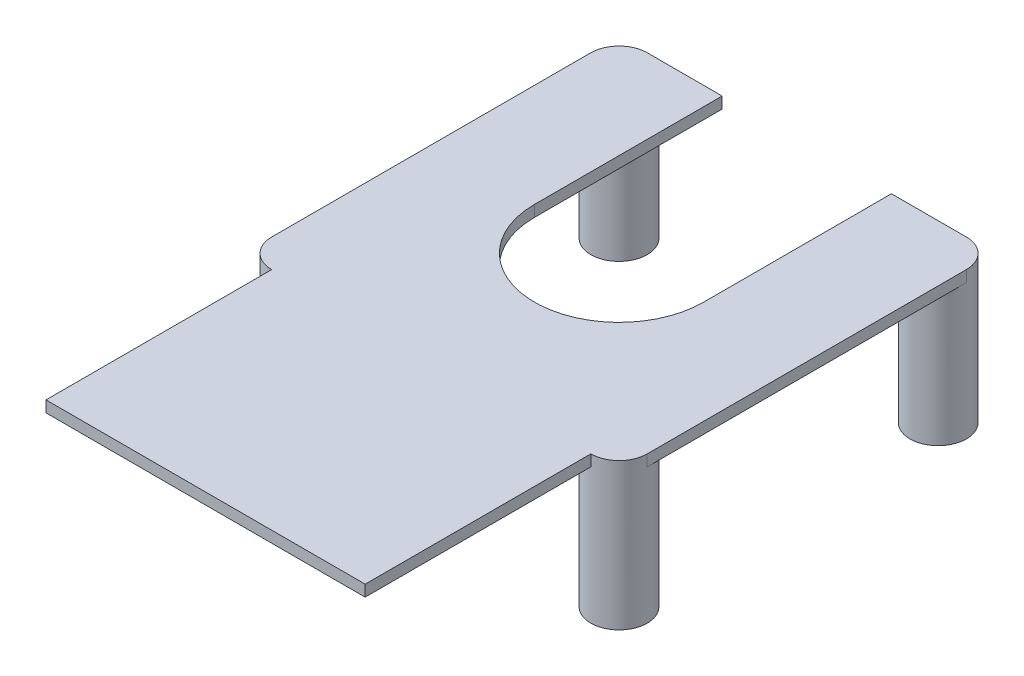
ISO-10303-21;
HEADER;
FILE_DESCRIPTION(('STEP AP214'),'2;1');
FILE_NAME('part.step','',(''),(''),'','','');
FILE_SCHEMA(('AUTOMOTIVE_DESIGN { 1 0 10303 214 1 1 1 1 }'));
ENDSEC;
DATA;
#1=APPLICATION_CONTEXT('core data for automotive mechanical design processes');
#2=APPLICATION_PROTOCOL_DEFINITION('international standard','automotive_design',2000,#1);
#3=PRODUCT_CONTEXT('',#1,'mechanical');
#4=PRODUCT('Part','Part','',(#3));
#5=PRODUCT_RELATED_PRODUCT_CATEGORY('part','',(#4));
#6=PRODUCT_DEFINITION_FORMATION('','',#4);
#7=PRODUCT_DEFINITION_CONTEXT('part definition',#1,'design');
#8=PRODUCT_DEFINITION('design','',#6,#7);
#9=PRODUCT_DEFINITION_SHAPE('','',#8);
#10=(LENGTH_UNIT() NAMED_UNIT(*) SI_UNIT(.MILLI.,.METRE.));
#11=(NAMED_UNIT(*) PLANE_ANGLE_UNIT() SI_UNIT($,.RADIAN.));
#12=(NAMED_UNIT(*) SI_UNIT($,.STERADIAN.) SOLID_ANGLE_UNIT());
#13=UNCERTAINTY_MEASURE_WITH_UNIT(LENGTH_MEASURE(1.E-05),#10,'distance_accuracy_value','');
#14=(GEOMETRIC_REPRESENTATION_CONTEXT(3) GLOBAL_UNCERTAINTY_ASSIGNED_CONTEXT((#13)) GLOBAL_UNIT_ASSIGNED_CONTEXT((#10,
#11,#12)) REPRESENTATION_CONTEXT('',''));
#15=CARTESIAN_POINT('',(0.,0.,0.));
#16=DIRECTION('',(0.,0.,1.));
#17=DIRECTION('',(1.,0.,0.));
#18=AXIS2_PLACEMENT_3D('',#15,#16,#17);
#19=CARTESIAN_POINT('',(-28.285,-24.,-4.99999999999999));
#20=DIRECTION('',(0.,1.,0.));
#21=DIRECTION('',(0.,0.,1.));
#22=AXIS2_PLACEMENT_3D('',#19,#20,#21);
#23=CYLINDRICAL_SURFACE('',#22,5.);
#24=CARTESIAN_POINT('',(-28.285,-24.,-4.99999999999999));
#25=DIRECTION('',(0.,1.,0.));
#26=DIRECTION('',(0.,0.,1.));
#27=AXIS2_PLACEMENT_3D('',#24,#25,#26);
#28=CIRCLE('',#27,5.);
#29=CARTESIAN_POINT('',(-28.285,-24.,0.));
#30=VERTEX_POINT('',#29);
#31=EDGE_CURVE('E11',#30,#30,#28,.T.);
#32=ORIENTED_EDGE('',*,*,#31,.T.);
#33=EDGE_LOOP('',(#32));
#34=FACE_BOUND('',#33,.T.);
#35=CARTESIAN_POINT('',(-28.285,0.,-4.99999999999999));
#36=DIRECTION('',(0.,1.,0.));
#37=DIRECTION('',(0.,0.,1.));
#38=AXIS2_PLACEMENT_3D('',#35,#36,#37);
#39=CIRCLE('',#38,5.);
#40=CARTESIAN_POINT('',(-28.285,0.,0.));
#41=VERTEX_POINT('',#40);
#42=CARTESIAN_POINT('',(-33.285,0.,-5.));
#43=VERTEX_POINT('',#42);
#44=EDGE_CURVE('E48',#41,#43,#39,.T.);
#45=ORIENTED_EDGE('',*,*,#44,.F.);
#46=DIRECTION('',(0.,-1.,0.));
#47=VECTOR('',#46,1.);
#48=CARTESIAN_POINT('',(-28.285,2.,0.));
#49=LINE('',#48,#47);
#50=CARTESIAN_POINT('',(-28.285,2.,0.));
#51=VERTEX_POINT('',#50);
#52=EDGE_CURVE('E275',#51,#41,#49,.T.);
#53=ORIENTED_EDGE('',*,*,#52,.F.);
#54=CARTESIAN_POINT('',(-28.285,2.,-4.99999999999999));
#55=DIRECTION('',(0.,1.,0.));
#56=DIRECTION('',(0.,0.,1.));
#57=AXIS2_PLACEMENT_3D('',#54,#55,#56);
#58=CIRCLE('',#57,5.);
#59=CARTESIAN_POINT('',(-33.285,2.,-4.99999999999999));
#60=VERTEX_POINT('',#59);
#61=EDGE_CURVE('E332',#60,#51,#58,.T.);
#62=ORIENTED_EDGE('',*,*,#61,.F.);
#63=DIRECTION('',(0.,-1.,0.));
#64=VECTOR('',#63,1.);
#65=CARTESIAN_POINT('',(-33.285,2.,-4.99999999999999));
#66=LINE('',#65,#64);
#67=EDGE_CURVE('E279',#60,#43,#66,.T.);
#68=ORIENTED_EDGE('',*,*,#67,.T.);
#69=EDGE_LOOP('',(#45,#53,#62,#68));
#70=FACE_BOUND('',#69,.T.);
#71=ADVANCED_FACE('F45',(#34,#70),#23,.T.);
#72=CARTESIAN_POINT('',(0.,-24.,0.));
#73=DIRECTION('',(0.,1.,0.));
#74=DIRECTION('',(0.,0.,1.));
#75=AXIS2_PLACEMENT_3D('',#72,#73,#74);
#76=PLANE('',#75);
#77=ORIENTED_EDGE('',*,*,#31,.F.);
#78=EDGE_LOOP('',(#77));
#79=FACE_BOUND('',#78,.T.);
#80=ADVANCED_FACE('F362',(#79),#76,.F.);
#81=CARTESIAN_POINT('',(0.,0.,0.));
#82=DIRECTION('',(0.,1.,0.));
#83=DIRECTION('',(0.,0.,1.));
#84=AXIS2_PLACEMENT_3D('',#81,#82,#83);
#85=PLANE('',#84);
#86=DIRECTION('',(0.,0.,1.));
#87=VECTOR('',#86,1.);
#88=CARTESIAN_POINT('',(33.285,0.,0.));
#89=LINE('',#88,#87);
#90=CARTESIAN_POINT('',(33.285,0.,-61.57));
#91=VERTEX_POINT('',#90);
#92=CARTESIAN_POINT('',(33.285,0.,-5.));
#93=VERTEX_POINT('',#92);
#94=EDGE_CURVE('E228',#91,#93,#89,.T.);
#95=ORIENTED_EDGE('',*,*,#94,.T.);
#96=CARTESIAN_POINT('',(28.285,0.,-4.99999999999999));
#97=DIRECTION('',(0.,1.,0.));
#98=DIRECTION('',(0.,0.,1.));
#99=AXIS2_PLACEMENT_3D('',#96,#97,#98);
#100=CIRCLE('',#99,5.);
#101=CARTESIAN_POINT('',(28.285,0.,0.));
#102=VERTEX_POINT('',#101);
#103=EDGE_CURVE('E210',#93,#102,#100,.T.);
#104=ORIENTED_EDGE('',*,*,#103,.T.);
#105=DIRECTION('',(0.,0.,1.));
#106=VECTOR('',#105,1.);
#107=CARTESIAN_POINT('',(28.285,0.,0.));
#108=LINE('',#107,#106);
#109=CARTESIAN_POINT('',(28.285,0.,40.));
#110=VERTEX_POINT('',#109);
#111=EDGE_CURVE('E226',#102,#110,#108,.T.);
#112=ORIENTED_EDGE('',*,*,#111,.T.);
#113=DIRECTION('',(-1.,0.,0.));
#114=VECTOR('',#113,1.);
#115=CARTESIAN_POINT('',(0.,0.,40.));
#116=LINE('',#115,#114);
#117=CARTESIAN_POINT('',(-28.285,0.,40.));
#118=VERTEX_POINT('',#117);
#119=EDGE_CURVE('E249',#110,#118,#116,.T.);
#120=ORIENTED_EDGE('',*,*,#119,.T.);
#121=DIRECTION('',(0.,0.,1.));
#122=VECTOR('',#121,1.);
#123=CARTESIAN_POINT('',(-28.285,0.,0.));
#124=LINE('',#123,#122);
#125=EDGE_CURVE('E255',#41,#118,#124,.T.);
#126=ORIENTED_EDGE('',*,*,#125,.F.);
#127=ORIENTED_EDGE('',*,*,#44,.T.);
#128=DIRECTION('',(0.,0.,-1.));
#129=VECTOR('',#128,1.);
#130=CARTESIAN_POINT('',(-33.285,0.,0.));
#131=LINE('',#130,#129);
#132=CARTESIAN_POINT('',(-33.285,0.,-61.57));
#133=VERTEX_POINT('',#132);
#134=EDGE_CURVE('E311',#43,#133,#131,.T.);
#135=ORIENTED_EDGE('',*,*,#134,.T.);
#136=CARTESIAN_POINT('',(-28.285,0.,-61.57));
#137=DIRECTION('',(0.,1.,0.));
#138=DIRECTION('',(0.,0.,1.));
#139=AXIS2_PLACEMENT_3D('',#136,#137,#138);
#140=CIRCLE('',#139,5.);
#141=CARTESIAN_POINT('',(-28.285,0.,-66.57));
#142=VERTEX_POINT('',#141);
#143=EDGE_CURVE('E201',#133,#142,#140,.T.);
#144=ORIENTED_EDGE('',*,*,#143,.T.);
#145=DIRECTION('',(1.,0.,0.));
#146=VECTOR('',#145,1.);
#147=CARTESIAN_POINT('',(0.,0.,-66.57));
#148=LINE('',#147,#146);
#149=CARTESIAN_POINT('',(-15.,0.,-66.57));
#150=VERTEX_POINT('',#149);
#151=EDGE_CURVE('E302',#142,#150,#148,.T.);
#152=ORIENTED_EDGE('',*,*,#151,.T.);
#153=DIRECTION('',(0.,0.,-1.));
#154=VECTOR('',#153,1.);
#155=CARTESIAN_POINT('',(-15.,0.,0.));
#156=LINE('',#155,#154);
#157=CARTESIAN_POINT('',(-15.,0.,-33.285));
#158=VERTEX_POINT('',#157);
#159=EDGE_CURVE('E299',#158,#150,#156,.T.);
#160=ORIENTED_EDGE('',*,*,#159,.F.);
#161=CARTESIAN_POINT('',(0.,0.,-33.285));
#162=DIRECTION('',(0.,1.,0.));
#163=DIRECTION('',(0.,0.,1.));
#164=AXIS2_PLACEMENT_3D('',#161,#162,#163);
#165=CIRCLE('',#164,15.);
#166=CARTESIAN_POINT('',(15.,0.,-33.285));
#167=VERTEX_POINT('',#166);
#168=EDGE_CURVE('E205',#158,#167,#165,.T.);
#169=ORIENTED_EDGE('',*,*,#168,.T.);
#170=DIRECTION('',(0.,0.,-1.));
#171=VECTOR('',#170,1.);
#172=CARTESIAN_POINT('',(15.,0.,0.));
#173=LINE('',#172,#171);
#174=CARTESIAN_POINT('',(15.,0.,-66.57));
#175=VERTEX_POINT('',#174);
#176=EDGE_CURVE('E194',#167,#175,#173,.T.);
#177=ORIENTED_EDGE('',*,*,#176,.T.);
#178=CARTESIAN_POINT('',(28.285,0.,-66.57));
#179=VERTEX_POINT('',#178);
#180=EDGE_CURVE('E253',#175,#179,#148,.T.);
#181=ORIENTED_EDGE('',*,*,#180,.T.);
#182=CARTESIAN_POINT('',(28.285,0.,-61.57));
#183=DIRECTION('',(0.,1.,0.));
#184=DIRECTION('',(0.,0.,1.));
#185=AXIS2_PLACEMENT_3D('',#182,#183,#184);
#186=CIRCLE('',#185,5.);
#187=EDGE_CURVE('E165',#179,#91,#186,.T.);
#188=ORIENTED_EDGE('',*,*,#187,.T.);
#189=EDGE_LOOP('',(#95,#104,#112,#120,#126,#127,#135,#144,#152,#160,#169,#177,#181,#188));
#190=FACE_BOUND('',#189,.T.);
#191=ADVANCED_FACE('F223',(#190),#85,.F.);
#192=CARTESIAN_POINT('',(0.,2.,-33.285));
#193=DIRECTION('',(0.,-1.,0.));
#194=DIRECTION('',(0.,0.,-1.));
#195=AXIS2_PLACEMENT_3D('',#192,#193,#194);
#196=CYLINDRICAL_SURFACE('',#195,15.);
#197=ORIENTED_EDGE('',*,*,#168,.F.);
#198=DIRECTION('',(0.,-1.,0.));
#199=VECTOR('',#198,1.);
#200=CARTESIAN_POINT('',(-15.,2.,-33.285));
#201=LINE('',#200,#199);
#202=CARTESIAN_POINT('',(-15.,2.,-33.285));
#203=VERTEX_POINT('',#202);
#204=EDGE_CURVE('E109',#203,#158,#201,.T.);
#205=ORIENTED_EDGE('',*,*,#204,.F.);
#206=CARTESIAN_POINT('',(0.,2.,-33.285));
#207=DIRECTION('',(0.,1.,0.));
#208=DIRECTION('',(0.,0.,1.));
#209=AXIS2_PLACEMENT_3D('',#206,#207,#208);
#210=CIRCLE('',#209,15.);
#211=CARTESIAN_POINT('',(15.,2.,-33.285));
#212=VERTEX_POINT('',#211);
#213=EDGE_CURVE('E191',#203,#212,#210,.T.);
#214=ORIENTED_EDGE('',*,*,#213,.T.);
#215=DIRECTION('',(0.,-1.,0.));
#216=VECTOR('',#215,1.);
#217=CARTESIAN_POINT('',(15.,2.,-33.285));
#218=LINE('',#217,#216);
#219=EDGE_CURVE('E68',#212,#167,#218,.T.);
#220=ORIENTED_EDGE('',*,*,#219,.T.);
#221=EDGE_LOOP('',(#197,#205,#214,#220));
#222=FACE_BOUND('',#221,.T.);
#223=ADVANCED_FACE('F305',(#222),#196,.F.);
#224=CARTESIAN_POINT('',(-15.,2.,0.));
#225=DIRECTION('',(-1.,0.,0.));
#226=DIRECTION('',(0.,0.,1.));
#227=AXIS2_PLACEMENT_3D('',#224,#225,#226);
#228=PLANE('',#227);
#229=ORIENTED_EDGE('',*,*,#159,.T.);
#230=DIRECTION('',(0.,-1.,0.));
#231=VECTOR('',#230,1.);
#232=CARTESIAN_POINT('',(-15.,2.,-66.57));
#233=LINE('',#232,#231);
#234=CARTESIAN_POINT('',(-15.,2.,-66.57));
#235=VERTEX_POINT('',#234);
#236=EDGE_CURVE('E290',#235,#150,#233,.T.);
#237=ORIENTED_EDGE('',*,*,#236,.F.);
#238=DIRECTION('',(0.,0.,-1.));
#239=VECTOR('',#238,1.);
#240=CARTESIAN_POINT('',(-15.,2.,0.));
#241=LINE('',#240,#239);
#242=EDGE_CURVE('E185',#203,#235,#241,.T.);
#243=ORIENTED_EDGE('',*,*,#242,.F.);
#244=ORIENTED_EDGE('',*,*,#204,.T.);
#245=EDGE_LOOP('',(#229,#237,#243,#244));
#246=FACE_BOUND('',#245,.T.);
#247=ADVANCED_FACE('F298',(#246),#228,.F.);
#248=CARTESIAN_POINT('',(0.,2.,-66.57));
#249=DIRECTION('',(0.,0.,-1.));
#250=DIRECTION('',(-1.,0.,0.));
#251=AXIS2_PLACEMENT_3D('',#248,#249,#250);
#252=PLANE('',#251);
#253=ORIENTED_EDGE('',*,*,#151,.F.);
#254=DIRECTION('',(0.,-1.,0.));
#255=VECTOR('',#254,1.);
#256=CARTESIAN_POINT('',(-28.285,2.,-66.57));
#257=LINE('',#256,#255);
#258=CARTESIAN_POINT('',(-28.285,2.,-66.57));
#259=VERTEX_POINT('',#258);
#260=EDGE_CURVE('E286',#259,#142,#257,.T.);
#261=ORIENTED_EDGE('',*,*,#260,.F.);
#262=DIRECTION('',(1.,0.,0.));
#263=VECTOR('',#262,1.);
#264=CARTESIAN_POINT('',(0.,2.,-66.57));
#265=LINE('',#264,#263);
#266=EDGE_CURVE('E177',#259,#235,#265,.T.);
#267=ORIENTED_EDGE('',*,*,#266,.T.);
#268=ORIENTED_EDGE('',*,*,#236,.T.);
#269=EDGE_LOOP('',(#253,#261,#267,#268));
#270=FACE_BOUND('',#269,.T.);
#271=ADVANCED_FACE('F347',(#270),#252,.T.);
#272=CARTESIAN_POINT('',(-28.285,2.,-61.57));
#273=DIRECTION('',(0.,-1.,0.));
#274=DIRECTION('',(0.,0.,-1.));
#275=AXIS2_PLACEMENT_3D('',#272,#273,#274);
#276=CYLINDRICAL_SURFACE('',#275,5.);
#277=ORIENTED_EDGE('',*,*,#260,.T.);
#278=ORIENTED_EDGE('',*,*,#143,.F.);
#279=DIRECTION('',(0.,-1.,0.));
#280=VECTOR('',#279,1.);
#281=CARTESIAN_POINT('',(-33.285,2.,-61.57));
#282=LINE('',#281,#280);
#283=CARTESIAN_POINT('',(-33.285,2.,-61.57));
#284=VERTEX_POINT('',#283);
#285=EDGE_CURVE('E282',#284,#133,#282,.T.);
#286=ORIENTED_EDGE('',*,*,#285,.F.);
#287=CARTESIAN_POINT('',(-28.285,2.,-61.57));
#288=DIRECTION('',(0.,1.,0.));
#289=DIRECTION('',(0.,0.,1.));
#290=AXIS2_PLACEMENT_3D('',#287,#288,#289);
#291=CIRCLE('',#290,5.);
#292=EDGE_CURVE('E184',#259,#284,#291,.T.);
#293=ORIENTED_EDGE('',*,*,#292,.F.);
#294=EDGE_LOOP('',(#277,#278,#286,#293));
#295=FACE_BOUND('',#294,.T.);
#296=CARTESIAN_POINT('',(-28.285,-24.,-61.57));
#297=DIRECTION('',(0.,1.,0.));
#298=DIRECTION('',(0.,0.,1.));
#299=AXIS2_PLACEMENT_3D('',#296,#297,#298);
#300=CIRCLE('',#299,5.);
#301=CARTESIAN_POINT('',(-28.285,-24.,-56.57));
#302=VERTEX_POINT('',#301);
#303=EDGE_CURVE('E197',#302,#302,#300,.T.);
#304=ORIENTED_EDGE('',*,*,#303,.T.);
#305=EDGE_LOOP('',(#304));
#306=FACE_BOUND('',#305,.T.);
#307=ADVANCED_FACE('F345',(#295,#306),#276,.T.);
#308=CARTESIAN_POINT('',(-33.285,2.,0.));
#309=DIRECTION('',(-1.,0.,0.));
#310=DIRECTION('',(0.,0.,1.));
#311=AXIS2_PLACEMENT_3D('',#308,#309,#310);
#312=PLANE('',#311);
#313=ORIENTED_EDGE('',*,*,#134,.F.);
#314=ORIENTED_EDGE('',*,*,#67,.F.);
#315=DIRECTION('',(0.,0.,-1.));
#316=VECTOR('',#315,1.);
#317=CARTESIAN_POINT('',(-33.285,2.,0.));
#318=LINE('',#317,#316);
#319=EDGE_CURVE('E190',#60,#284,#318,.T.);
#320=ORIENTED_EDGE('',*,*,#319,.T.);
#321=ORIENTED_EDGE('',*,*,#285,.T.);
#322=EDGE_LOOP('',(#313,#314,#320,#321));
#323=FACE_BOUND('',#322,.T.);
#324=ADVANCED_FACE('F354',(#323),#312,.T.);
#325=CARTESIAN_POINT('',(-28.285,2.,0.));
#326=DIRECTION('',(1.,0.,0.));
#327=DIRECTION('',(0.,0.,-1.));
#328=AXIS2_PLACEMENT_3D('',#325,#326,#327);
#329=PLANE('',#328);
#330=ORIENTED_EDGE('',*,*,#125,.T.);
#331=DIRECTION('',(0.,-1.,0.));
#332=VECTOR('',#331,1.);
#333=CARTESIAN_POINT('',(-28.285,2.,40.));
#334=LINE('',#333,#332);
#335=CARTESIAN_POINT('',(-28.285,2.,40.));
#336=VERTEX_POINT('',#335);
#337=EDGE_CURVE('E272',#336,#118,#334,.T.);
#338=ORIENTED_EDGE('',*,*,#337,.F.);
#339=DIRECTION('',(0.,0.,1.));
#340=VECTOR('',#339,1.);
#341=CARTESIAN_POINT('',(-28.285,2.,0.));
#342=LINE('',#341,#340);
#343=EDGE_CURVE('E327',#51,#336,#342,.T.);
#344=ORIENTED_EDGE('',*,*,#343,.F.);
#345=ORIENTED_EDGE('',*,*,#52,.T.);
#346=EDGE_LOOP('',(#330,#338,#344,#345));
#347=FACE_BOUND('',#346,.T.);
#348=ADVANCED_FACE('F317',(#347),#329,.F.);
#349=CARTESIAN_POINT('',(0.,2.,40.));
#350=DIRECTION('',(0.,0.,1.));
#351=DIRECTION('',(1.,0.,0.));
#352=AXIS2_PLACEMENT_3D('',#349,#350,#351);
#353=PLANE('',#352);
#354=ORIENTED_EDGE('',*,*,#119,.F.);
#355=DIRECTION('',(0.,-1.,0.));
#356=VECTOR('',#355,1.);
#357=CARTESIAN_POINT('',(28.285,2.,40.));
#358=LINE('',#357,#356);
#359=CARTESIAN_POINT('',(28.285,2.,40.));
#360=VERTEX_POINT('',#359);
#361=EDGE_CURVE('E243',#360,#110,#358,.T.);
#362=ORIENTED_EDGE('',*,*,#361,.F.);
#363=DIRECTION('',(-1.,0.,0.));
#364=VECTOR('',#363,1.);
#365=CARTESIAN_POINT('',(0.,2.,40.));
#366=LINE('',#365,#364);
#367=EDGE_CURVE('E324',#360,#336,#366,.T.);
#368=ORIENTED_EDGE('',*,*,#367,.T.);
#369=ORIENTED_EDGE('',*,*,#337,.T.);
#370=EDGE_LOOP('',(#354,#362,#368,#369));
#371=FACE_BOUND('',#370,.T.);
#372=ADVANCED_FACE('F322',(#371),#353,.T.);
#373=CARTESIAN_POINT('',(28.285,2.,0.));
#374=DIRECTION('',(1.,0.,0.));
#375=DIRECTION('',(0.,0.,-1.));
#376=AXIS2_PLACEMENT_3D('',#373,#374,#375);
#377=PLANE('',#376);
#378=ORIENTED_EDGE('',*,*,#111,.F.);
#379=DIRECTION('',(0.,-1.,0.));
#380=VECTOR('',#379,1.);
#381=CARTESIAN_POINT('',(28.285,2.,0.));
#382=LINE('',#381,#380);
#383=CARTESIAN_POINT('',(28.285,2.,0.));
#384=VERTEX_POINT('',#383);
#385=EDGE_CURVE('E235',#384,#102,#382,.T.);
#386=ORIENTED_EDGE('',*,*,#385,.F.);
#387=DIRECTION('',(0.,0.,1.));
#388=VECTOR('',#387,1.);
#389=CARTESIAN_POINT('',(28.285,2.,0.));
#390=LINE('',#389,#388);
#391=EDGE_CURVE('E326',#384,#360,#390,.T.);
#392=ORIENTED_EDGE('',*,*,#391,.T.);
#393=ORIENTED_EDGE('',*,*,#361,.T.);
#394=EDGE_LOOP('',(#378,#386,#392,#393));
#395=FACE_BOUND('',#394,.T.);
#396=ADVANCED_FACE('F246',(#395),#377,.T.);
#397=CARTESIAN_POINT('',(28.285,2.,-4.99999999999999));
#398=DIRECTION('',(0.,-1.,0.));
#399=DIRECTION('',(0.,0.,-1.));
#400=AXIS2_PLACEMENT_3D('',#397,#398,#399);
#401=CYLINDRICAL_SURFACE('',#400,5.);
#402=ORIENTED_EDGE('',*,*,#385,.T.);
#403=ORIENTED_EDGE('',*,*,#103,.F.);
#404=DIRECTION('',(0.,-1.,0.));
#405=VECTOR('',#404,1.);
#406=CARTESIAN_POINT('',(33.285,2.,-5.));
#407=LINE('',#406,#405);
#408=CARTESIAN_POINT('',(33.285,2.,-5.));
#409=VERTEX_POINT('',#408);
#410=EDGE_CURVE('E244',#409,#93,#407,.T.);
#411=ORIENTED_EDGE('',*,*,#410,.F.);
#412=CARTESIAN_POINT('',(28.285,2.,-4.99999999999999));
#413=DIRECTION('',(0.,1.,0.));
#414=DIRECTION('',(0.,0.,1.));
#415=AXIS2_PLACEMENT_3D('',#412,#413,#414);
#416=CIRCLE('',#415,5.);
#417=EDGE_CURVE('E238',#384,#409,#416,.T.);
#418=ORIENTED_EDGE('',*,*,#417,.F.);
#419=EDGE_LOOP('',(#402,#403,#411,#418));
#420=FACE_BOUND('',#419,.T.);
#421=CARTESIAN_POINT('',(28.285,-24.,-4.99999999999999));
#422=DIRECTION('',(0.,1.,0.));
#423=DIRECTION('',(0.,0.,1.));
#424=AXIS2_PLACEMENT_3D('',#421,#422,#423);
#425=CIRCLE('',#424,5.);
#426=CARTESIAN_POINT('',(28.285,-24.,0.));
#427=VERTEX_POINT('',#426);
#428=EDGE_CURVE('E213',#427,#427,#425,.T.);
#429=ORIENTED_EDGE('',*,*,#428,.T.);
#430=EDGE_LOOP('',(#429));
#431=FACE_BOUND('',#430,.T.);
#432=ADVANCED_FACE('F236',(#420,#431),#401,.T.);
#433=CARTESIAN_POINT('',(33.285,2.,0.));
#434=DIRECTION('',(1.,0.,0.));
#435=DIRECTION('',(0.,0.,-1.));
#436=AXIS2_PLACEMENT_3D('',#433,#434,#435);
#437=PLANE('',#436);
#438=ORIENTED_EDGE('',*,*,#94,.F.);
#439=DIRECTION('',(0.,-1.,0.));
#440=VECTOR('',#439,1.);
#441=CARTESIAN_POINT('',(33.285,2.,-61.57));
#442=LINE('',#441,#440);
#443=CARTESIAN_POINT('',(33.285,2.,-61.57));
#444=VERTEX_POINT('',#443);
#445=EDGE_CURVE('E170',#444,#91,#442,.T.);
#446=ORIENTED_EDGE('',*,*,#445,.F.);
#447=DIRECTION('',(0.,0.,1.));
#448=VECTOR('',#447,1.);
#449=CARTESIAN_POINT('',(33.285,2.,0.));
#450=LINE('',#449,#448);
#451=EDGE_CURVE('E155',#444,#409,#450,.T.);
#452=ORIENTED_EDGE('',*,*,#451,.T.);
#453=ORIENTED_EDGE('',*,*,#410,.T.);
#454=EDGE_LOOP('',(#438,#446,#452,#453));
#455=FACE_BOUND('',#454,.T.);
#456=ADVANCED_FACE('F340',(#455),#437,.T.);
#457=CARTESIAN_POINT('',(28.285,2.,-61.57));
#458=DIRECTION('',(0.,-1.,0.));
#459=DIRECTION('',(0.,0.,-1.));
#460=AXIS2_PLACEMENT_3D('',#457,#458,#459);
#461=CYLINDRICAL_SURFACE('',#460,5.);
#462=ORIENTED_EDGE('',*,*,#445,.T.);
#463=ORIENTED_EDGE('',*,*,#187,.F.);
#464=DIRECTION('',(0.,-1.,0.));
#465=VECTOR('',#464,1.);
#466=CARTESIAN_POINT('',(28.285,2.,-66.57));
#467=LINE('',#466,#465);
#468=CARTESIAN_POINT('',(28.285,2.,-66.57));
#469=VERTEX_POINT('',#468);
#470=EDGE_CURVE('E161',#469,#179,#467,.T.);
#471=ORIENTED_EDGE('',*,*,#470,.F.);
#472=CARTESIAN_POINT('',(28.285,2.,-61.57));
#473=DIRECTION('',(0.,1.,0.));
#474=DIRECTION('',(0.,0.,1.));
#475=AXIS2_PLACEMENT_3D('',#472,#473,#474);
#476=CIRCLE('',#475,5.);
#477=EDGE_CURVE('E147',#444,#469,#476,.T.);
#478=ORIENTED_EDGE('',*,*,#477,.F.);
#479=EDGE_LOOP('',(#462,#463,#471,#478));
#480=FACE_BOUND('',#479,.T.);
#481=CARTESIAN_POINT('',(28.285,-24.,-61.57));
#482=DIRECTION('',(0.,1.,0.));
#483=DIRECTION('',(0.,0.,1.));
#484=AXIS2_PLACEMENT_3D('',#481,#482,#483);
#485=CIRCLE('',#484,5.);
#486=CARTESIAN_POINT('',(28.285,-24.,-56.57));
#487=VERTEX_POINT('',#486);
#488=EDGE_CURVE('E206',#487,#487,#485,.T.);
#489=ORIENTED_EDGE('',*,*,#488,.T.);
#490=EDGE_LOOP('',(#489));
#491=FACE_BOUND('',#490,.T.);
#492=ADVANCED_FACE('F162',(#480,#491),#461,.T.);
#493=ORIENTED_EDGE('',*,*,#180,.F.);
#494=DIRECTION('',(0.,-1.,0.));
#495=VECTOR('',#494,1.);
#496=CARTESIAN_POINT('',(15.,2.,-66.57));
#497=LINE('',#496,#495);
#498=CARTESIAN_POINT('',(15.,2.,-66.57));
#499=VERTEX_POINT('',#498);
#500=EDGE_CURVE('E171',#499,#175,#497,.T.);
#501=ORIENTED_EDGE('',*,*,#500,.F.);
#502=EDGE_CURVE('E153',#499,#469,#265,.T.);
#503=ORIENTED_EDGE('',*,*,#502,.T.);
#504=ORIENTED_EDGE('',*,*,#470,.T.);
#505=EDGE_LOOP('',(#493,#501,#503,#504));
#506=FACE_BOUND('',#505,.T.);
#507=ADVANCED_FACE('F173',(#506),#252,.T.);
#508=CARTESIAN_POINT('',(15.,2.,0.));
#509=DIRECTION('',(-1.,0.,0.));
#510=DIRECTION('',(0.,0.,1.));
#511=AXIS2_PLACEMENT_3D('',#508,#509,#510);
#512=PLANE('',#511);
#513=ORIENTED_EDGE('',*,*,#176,.F.);
#514=ORIENTED_EDGE('',*,*,#219,.F.);
#515=DIRECTION('',(0.,0.,-1.));
#516=VECTOR('',#515,1.);
#517=CARTESIAN_POINT('',(15.,2.,0.));
#518=LINE('',#517,#516);
#519=EDGE_CURVE('E175',#212,#499,#518,.T.);
#520=ORIENTED_EDGE('',*,*,#519,.T.);
#521=ORIENTED_EDGE('',*,*,#500,.T.);
#522=EDGE_LOOP('',(#513,#514,#520,#521));
#523=FACE_BOUND('',#522,.T.);
#524=ADVANCED_FACE('F360',(#523),#512,.T.);
#525=CARTESIAN_POINT('',(0.,2.,0.));
#526=DIRECTION('',(0.,1.,0.));
#527=DIRECTION('',(0.,0.,1.));
#528=AXIS2_PLACEMENT_3D('',#525,#526,#527);
#529=PLANE('',#528);
#530=ORIENTED_EDGE('',*,*,#213,.F.);
#531=ORIENTED_EDGE('',*,*,#242,.T.);
#532=ORIENTED_EDGE('',*,*,#266,.F.);
#533=ORIENTED_EDGE('',*,*,#292,.T.);
#534=ORIENTED_EDGE('',*,*,#319,.F.);
#535=ORIENTED_EDGE('',*,*,#61,.T.);
#536=ORIENTED_EDGE('',*,*,#343,.T.);
#537=ORIENTED_EDGE('',*,*,#367,.F.);
#538=ORIENTED_EDGE('',*,*,#391,.F.);
#539=ORIENTED_EDGE('',*,*,#417,.T.);
#540=ORIENTED_EDGE('',*,*,#451,.F.);
#541=ORIENTED_EDGE('',*,*,#477,.T.);
#542=ORIENTED_EDGE('',*,*,#502,.F.);
#543=ORIENTED_EDGE('',*,*,#519,.F.);
#544=EDGE_LOOP('',(#530,#531,#532,#533,#534,#535,#536,#537,#538,#539,#540,#541,#542,#543));
#545=FACE_BOUND('',#544,.T.);
#546=ADVANCED_FACE('F150',(#545),#529,.T.);
#547=CARTESIAN_POINT('',(0.,-24.,0.));
#548=DIRECTION('',(0.,1.,0.));
#549=DIRECTION('',(0.,0.,1.));
#550=AXIS2_PLACEMENT_3D('',#547,#548,#549);
#551=PLANE('',#550);
#552=ORIENTED_EDGE('',*,*,#303,.F.);
#553=EDGE_LOOP('',(#552));
#554=FACE_BOUND('',#553,.T.);
#555=ADVANCED_FACE('F398',(#554),#551,.F.);
#556=CARTESIAN_POINT('',(0.,-24.,0.));
#557=DIRECTION('',(0.,1.,0.));
#558=DIRECTION('',(0.,0.,1.));
#559=AXIS2_PLACEMENT_3D('',#556,#557,#558);
#560=PLANE('',#559);
#561=ORIENTED_EDGE('',*,*,#488,.F.);
#562=EDGE_LOOP('',(#561));
#563=FACE_BOUND('',#562,.T.);
#564=ADVANCED_FACE('F403',(#563),#560,.F.);
#565=CARTESIAN_POINT('',(28.285,-24.,-4.99999999999999));
#566=DIRECTION('',(0.,1.,0.));
#567=DIRECTION('',(0.,0.,1.));
#568=AXIS2_PLACEMENT_3D('',#565,#566,#567);
#569=PLANE('',#568);
#570=ORIENTED_EDGE('',*,*,#428,.F.);
#571=EDGE_LOOP('',(#570));
#572=FACE_BOUND('',#571,.T.);
#573=ADVANCED_FACE('F408',(#572),#569,.F.);
#574=CLOSED_SHELL('',(#71,#80,#191,#223,#247,#271,#307,#324,#348,#372,#396,#432,#456,#492,#507,
#524,#546,#555,#564,#573));
#575=MANIFOLD_SOLID_BREP('B2',#574);
#576=ADVANCED_BREP_SHAPE_REPRESENTATION('',(#18,#575),#14);
#577=SHAPE_DEFINITION_REPRESENTATION(#9,#576);
ENDSEC;
END-ISO-10303-21;
